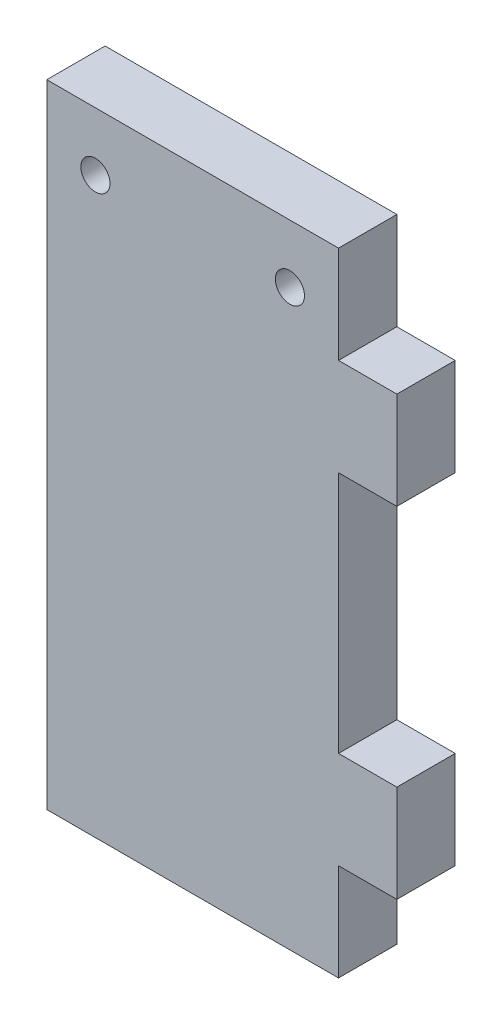
ISO-10303-21;
HEADER;
FILE_DESCRIPTION(('STEP AP214'),'2;1');
FILE_NAME('part.step','',(''),(''),'','','');
FILE_SCHEMA(('AUTOMOTIVE_DESIGN { 1 0 10303 214 1 1 1 1 }'));
ENDSEC;
DATA;
#1=APPLICATION_CONTEXT('core data for automotive mechanical design processes');
#2=APPLICATION_PROTOCOL_DEFINITION('international standard','automotive_design',2000,#1);
#3=PRODUCT_CONTEXT('',#1,'mechanical');
#4=PRODUCT('Part','Part','',(#3));
#5=PRODUCT_RELATED_PRODUCT_CATEGORY('part','',(#4));
#6=PRODUCT_DEFINITION_FORMATION('','',#4);
#7=PRODUCT_DEFINITION_CONTEXT('part definition',#1,'design');
#8=PRODUCT_DEFINITION('design','',#6,#7);
#9=PRODUCT_DEFINITION_SHAPE('','',#8);
#10=(LENGTH_UNIT() NAMED_UNIT(*) SI_UNIT(.MILLI.,.METRE.));
#11=(NAMED_UNIT(*) PLANE_ANGLE_UNIT() SI_UNIT($,.RADIAN.));
#12=(NAMED_UNIT(*) SI_UNIT($,.STERADIAN.) SOLID_ANGLE_UNIT());
#13=UNCERTAINTY_MEASURE_WITH_UNIT(LENGTH_MEASURE(1.E-05),#10,'distance_accuracy_value','');
#14=(GEOMETRIC_REPRESENTATION_CONTEXT(3) GLOBAL_UNCERTAINTY_ASSIGNED_CONTEXT((#13)) GLOBAL_UNIT_ASSIGNED_CONTEXT((#10,
#11,#12)) REPRESENTATION_CONTEXT('',''));
#15=CARTESIAN_POINT('',(0.,0.,0.));
#16=DIRECTION('',(0.,0.,1.));
#17=DIRECTION('',(1.,0.,0.));
#18=AXIS2_PLACEMENT_3D('',#15,#16,#17);
#19=CARTESIAN_POINT('',(0.,0.,6.));
#20=DIRECTION('',(-1.,0.,0.));
#21=DIRECTION('',(0.,-1.,0.));
#22=AXIS2_PLACEMENT_3D('',#19,#20,#21);
#23=PLANE('',#22);
#24=DIRECTION('',(0.,0.,-1.));
#25=VECTOR('',#24,1.);
#26=CARTESIAN_POINT('',(0.,45.,6.));
#27=LINE('',#26,#25);
#28=CARTESIAN_POINT('',(0.,45.,6.));
#29=VERTEX_POINT('',#28);
#30=CARTESIAN_POINT('',(0.,45.,0.));
#31=VERTEX_POINT('',#30);
#32=EDGE_CURVE('E56',#29,#31,#27,.T.);
#33=ORIENTED_EDGE('',*,*,#32,.F.);
#34=DIRECTION('',(0.,1.,0.));
#35=VECTOR('',#34,1.);
#36=CARTESIAN_POINT('',(0.,0.,6.));
#37=LINE('',#36,#35);
#38=CARTESIAN_POINT('',(0.,20.,6.));
#39=VERTEX_POINT('',#38);
#40=EDGE_CURVE('E147',#39,#29,#37,.T.);
#41=ORIENTED_EDGE('',*,*,#40,.F.);
#42=DIRECTION('',(0.,0.,1.));
#43=VECTOR('',#42,1.);
#44=CARTESIAN_POINT('',(0.,20.,6.));
#45=LINE('',#44,#43);
#46=CARTESIAN_POINT('',(0.,20.,0.));
#47=VERTEX_POINT('',#46);
#48=EDGE_CURVE('E151',#47,#39,#45,.T.);
#49=ORIENTED_EDGE('',*,*,#48,.F.);
#50=DIRECTION('',(0.,1.,0.));
#51=VECTOR('',#50,1.);
#52=CARTESIAN_POINT('',(0.,0.,0.));
#53=LINE('',#52,#51);
#54=EDGE_CURVE('E194',#47,#31,#53,.T.);
#55=ORIENTED_EDGE('',*,*,#54,.T.);
#56=EDGE_LOOP('',(#33,#41,#49,#55));
#57=FACE_BOUND('',#56,.T.);
#58=ADVANCED_FACE('F32',(#57),#23,.F.);
#59=DIRECTION('',(0.,0.,1.));
#60=VECTOR('',#59,1.);
#61=CARTESIAN_POINT('',(0.,55.,6.));
#62=LINE('',#61,#60);
#63=CARTESIAN_POINT('',(0.,55.,0.));
#64=VERTEX_POINT('',#63);
#65=CARTESIAN_POINT('',(0.,55.,6.));
#66=VERTEX_POINT('',#65);
#67=EDGE_CURVE('E142',#64,#66,#62,.T.);
#68=ORIENTED_EDGE('',*,*,#67,.F.);
#69=CARTESIAN_POINT('',(0.,65.,0.));
#70=VERTEX_POINT('',#69);
#71=EDGE_CURVE('E182',#64,#70,#53,.T.);
#72=ORIENTED_EDGE('',*,*,#71,.T.);
#73=DIRECTION('',(0.,0.,-1.));
#74=VECTOR('',#73,1.);
#75=CARTESIAN_POINT('',(0.,65.,6.));
#76=LINE('',#75,#74);
#77=CARTESIAN_POINT('',(0.,65.,6.));
#78=VERTEX_POINT('',#77);
#79=EDGE_CURVE('E11',#78,#70,#76,.T.);
#80=ORIENTED_EDGE('',*,*,#79,.F.);
#81=EDGE_CURVE('E35',#66,#78,#37,.T.);
#82=ORIENTED_EDGE('',*,*,#81,.F.);
#83=EDGE_LOOP('',(#68,#72,#80,#82));
#84=FACE_BOUND('',#83,.T.);
#85=ADVANCED_FACE('F247',(#84),#23,.F.);
#86=DIRECTION('',(0.,0.,-1.));
#87=VECTOR('',#86,1.);
#88=CARTESIAN_POINT('',(0.,10.,6.));
#89=LINE('',#88,#87);
#90=CARTESIAN_POINT('',(0.,10.,6.));
#91=VERTEX_POINT('',#90);
#92=CARTESIAN_POINT('',(0.,10.,0.));
#93=VERTEX_POINT('',#92);
#94=EDGE_CURVE('E148',#91,#93,#89,.T.);
#95=ORIENTED_EDGE('',*,*,#94,.F.);
#96=CARTESIAN_POINT('',(0.,0.,6.));
#97=VERTEX_POINT('',#96);
#98=EDGE_CURVE('E240',#97,#91,#37,.T.);
#99=ORIENTED_EDGE('',*,*,#98,.F.);
#100=DIRECTION('',(0.,0.,-1.));
#101=VECTOR('',#100,1.);
#102=CARTESIAN_POINT('',(0.,0.,6.));
#103=LINE('',#102,#101);
#104=CARTESIAN_POINT('',(0.,0.,0.));
#105=VERTEX_POINT('',#104);
#106=EDGE_CURVE('E213',#97,#105,#103,.T.);
#107=ORIENTED_EDGE('',*,*,#106,.T.);
#108=EDGE_CURVE('E206',#105,#93,#53,.T.);
#109=ORIENTED_EDGE('',*,*,#108,.T.);
#110=EDGE_LOOP('',(#95,#99,#107,#109));
#111=FACE_BOUND('',#110,.T.);
#112=ADVANCED_FACE('F239',(#111),#23,.F.);
#113=CARTESIAN_POINT('',(0.,65.,6.));
#114=DIRECTION('',(0.,-1.,0.));
#115=DIRECTION('',(0.,0.,-1.));
#116=AXIS2_PLACEMENT_3D('',#113,#114,#115);
#117=PLANE('',#116);
#118=DIRECTION('',(-1.,0.,0.));
#119=VECTOR('',#118,1.);
#120=CARTESIAN_POINT('',(0.,65.,0.));
#121=LINE('',#120,#119);
#122=CARTESIAN_POINT('',(-30.,65.,0.));
#123=VERTEX_POINT('',#122);
#124=EDGE_CURVE('E200',#70,#123,#121,.T.);
#125=ORIENTED_EDGE('',*,*,#124,.T.);
#126=DIRECTION('',(0.,0.,-1.));
#127=VECTOR('',#126,1.);
#128=CARTESIAN_POINT('',(-30.,65.,6.));
#129=LINE('',#128,#127);
#130=CARTESIAN_POINT('',(-30.,65.,6.));
#131=VERTEX_POINT('',#130);
#132=EDGE_CURVE('E41',#131,#123,#129,.T.);
#133=ORIENTED_EDGE('',*,*,#132,.F.);
#134=DIRECTION('',(-1.,0.,0.));
#135=VECTOR('',#134,1.);
#136=CARTESIAN_POINT('',(0.,65.,6.));
#137=LINE('',#136,#135);
#138=EDGE_CURVE('E242',#78,#131,#137,.T.);
#139=ORIENTED_EDGE('',*,*,#138,.F.);
#140=ORIENTED_EDGE('',*,*,#79,.T.);
#141=EDGE_LOOP('',(#125,#133,#139,#140));
#142=FACE_BOUND('',#141,.T.);
#143=ADVANCED_FACE('F224',(#142),#117,.F.);
#144=CARTESIAN_POINT('',(-30.,0.,6.));
#145=DIRECTION('',(1.,0.,0.));
#146=DIRECTION('',(0.,0.,-1.));
#147=AXIS2_PLACEMENT_3D('',#144,#145,#146);
#148=PLANE('',#147);
#149=DIRECTION('',(0.,-1.,0.));
#150=VECTOR('',#149,1.);
#151=CARTESIAN_POINT('',(-30.,0.,0.));
#152=LINE('',#151,#150);
#153=CARTESIAN_POINT('',(-30.,0.,0.));
#154=VERTEX_POINT('',#153);
#155=EDGE_CURVE('E217',#123,#154,#152,.T.);
#156=ORIENTED_EDGE('',*,*,#155,.T.);
#157=DIRECTION('',(0.,0.,-1.));
#158=VECTOR('',#157,1.);
#159=CARTESIAN_POINT('',(-30.,0.,6.));
#160=LINE('',#159,#158);
#161=CARTESIAN_POINT('',(-30.,0.,6.));
#162=VERTEX_POINT('',#161);
#163=EDGE_CURVE('E210',#162,#154,#160,.T.);
#164=ORIENTED_EDGE('',*,*,#163,.F.);
#165=DIRECTION('',(0.,-1.,0.));
#166=VECTOR('',#165,1.);
#167=CARTESIAN_POINT('',(-30.,0.,6.));
#168=LINE('',#167,#166);
#169=EDGE_CURVE('E229',#131,#162,#168,.T.);
#170=ORIENTED_EDGE('',*,*,#169,.F.);
#171=ORIENTED_EDGE('',*,*,#132,.T.);
#172=EDGE_LOOP('',(#156,#164,#170,#171));
#173=FACE_BOUND('',#172,.T.);
#174=ADVANCED_FACE('F228',(#173),#148,.F.);
#175=CARTESIAN_POINT('',(0.,0.,6.));
#176=DIRECTION('',(0.,1.,0.));
#177=DIRECTION('',(-1.,0.,0.));
#178=AXIS2_PLACEMENT_3D('',#175,#176,#177);
#179=PLANE('',#178);
#180=DIRECTION('',(1.,0.,0.));
#181=VECTOR('',#180,1.);
#182=CARTESIAN_POINT('',(0.,0.,0.));
#183=LINE('',#182,#181);
#184=EDGE_CURVE('E216',#154,#105,#183,.T.);
#185=ORIENTED_EDGE('',*,*,#184,.T.);
#186=ORIENTED_EDGE('',*,*,#106,.F.);
#187=DIRECTION('',(1.,0.,0.));
#188=VECTOR('',#187,1.);
#189=CARTESIAN_POINT('',(0.,0.,6.));
#190=LINE('',#189,#188);
#191=EDGE_CURVE('E198',#162,#97,#190,.T.);
#192=ORIENTED_EDGE('',*,*,#191,.F.);
#193=ORIENTED_EDGE('',*,*,#163,.T.);
#194=EDGE_LOOP('',(#185,#186,#192,#193));
#195=FACE_BOUND('',#194,.T.);
#196=ADVANCED_FACE('F235',(#195),#179,.F.);
#197=CARTESIAN_POINT('',(0.,0.,6.));
#198=DIRECTION('',(0.,0.,1.));
#199=DIRECTION('',(1.,0.,0.));
#200=AXIS2_PLACEMENT_3D('',#197,#198,#199);
#201=PLANE('',#200);
#202=CARTESIAN_POINT('',(-5.,59.,6.));
#203=DIRECTION('',(0.,0.,1.));
#204=DIRECTION('',(1.,0.,0.));
#205=AXIS2_PLACEMENT_3D('',#202,#203,#204);
#206=CIRCLE('',#205,1.5);
#207=CARTESIAN_POINT('',(-3.5,59.,6.));
#208=VERTEX_POINT('',#207);
#209=EDGE_CURVE('E268',#208,#208,#206,.T.);
#210=ORIENTED_EDGE('',*,*,#209,.F.);
#211=EDGE_LOOP('',(#210));
#212=FACE_BOUND('',#211,.T.);
#213=CARTESIAN_POINT('',(-25.,59.,6.));
#214=DIRECTION('',(0.,0.,1.));
#215=DIRECTION('',(1.,0.,0.));
#216=AXIS2_PLACEMENT_3D('',#213,#214,#215);
#217=CIRCLE('',#216,1.5);
#218=CARTESIAN_POINT('',(-23.5,59.,6.));
#219=VERTEX_POINT('',#218);
#220=EDGE_CURVE('E260',#219,#219,#217,.T.);
#221=ORIENTED_EDGE('',*,*,#220,.F.);
#222=EDGE_LOOP('',(#221));
#223=FACE_BOUND('',#222,.T.);
#224=ORIENTED_EDGE('',*,*,#98,.T.);
#225=DIRECTION('',(-1.,0.,0.));
#226=VECTOR('',#225,1.);
#227=CARTESIAN_POINT('',(6.,10.,6.));
#228=LINE('',#227,#226);
#229=CARTESIAN_POINT('',(6.,10.,6.));
#230=VERTEX_POINT('',#229);
#231=EDGE_CURVE('E176',#230,#91,#228,.T.);
#232=ORIENTED_EDGE('',*,*,#231,.F.);
#233=DIRECTION('',(0.,-1.,0.));
#234=VECTOR('',#233,1.);
#235=CARTESIAN_POINT('',(6.,20.,6.));
#236=LINE('',#235,#234);
#237=CARTESIAN_POINT('',(6.,20.,6.));
#238=VERTEX_POINT('',#237);
#239=EDGE_CURVE('E157',#238,#230,#236,.T.);
#240=ORIENTED_EDGE('',*,*,#239,.F.);
#241=DIRECTION('',(-1.,0.,0.));
#242=VECTOR('',#241,1.);
#243=CARTESIAN_POINT('',(6.,20.,6.));
#244=LINE('',#243,#242);
#245=EDGE_CURVE('E166',#238,#39,#244,.T.);
#246=ORIENTED_EDGE('',*,*,#245,.T.);
#247=ORIENTED_EDGE('',*,*,#40,.T.);
#248=DIRECTION('',(-1.,0.,0.));
#249=VECTOR('',#248,1.);
#250=CARTESIAN_POINT('',(6.,45.,6.));
#251=LINE('',#250,#249);
#252=CARTESIAN_POINT('',(6.,45.,6.));
#253=VERTEX_POINT('',#252);
#254=EDGE_CURVE('E127',#253,#29,#251,.T.);
#255=ORIENTED_EDGE('',*,*,#254,.F.);
#256=DIRECTION('',(0.,-1.,0.));
#257=VECTOR('',#256,1.);
#258=CARTESIAN_POINT('',(6.,55.,6.));
#259=LINE('',#258,#257);
#260=CARTESIAN_POINT('',(6.,55.,6.));
#261=VERTEX_POINT('',#260);
#262=EDGE_CURVE('E133',#261,#253,#259,.T.);
#263=ORIENTED_EDGE('',*,*,#262,.F.);
#264=DIRECTION('',(-1.,0.,0.));
#265=VECTOR('',#264,1.);
#266=CARTESIAN_POINT('',(6.,55.,6.));
#267=LINE('',#266,#265);
#268=EDGE_CURVE('E251',#261,#66,#267,.T.);
#269=ORIENTED_EDGE('',*,*,#268,.T.);
#270=ORIENTED_EDGE('',*,*,#81,.T.);
#271=ORIENTED_EDGE('',*,*,#138,.T.);
#272=ORIENTED_EDGE('',*,*,#169,.T.);
#273=ORIENTED_EDGE('',*,*,#191,.T.);
#274=EDGE_LOOP('',(#224,#232,#240,#246,#247,#255,#263,#269,#270,#271,#272,#273));
#275=FACE_BOUND('',#274,.T.);
#276=ADVANCED_FACE('F145',(#212,#223,#275),#201,.T.);
#277=CARTESIAN_POINT('',(0.,0.,0.));
#278=DIRECTION('',(0.,0.,1.));
#279=DIRECTION('',(1.,0.,0.));
#280=AXIS2_PLACEMENT_3D('',#277,#278,#279);
#281=PLANE('',#280);
#282=CARTESIAN_POINT('',(-5.,59.,0.));
#283=DIRECTION('',(0.,0.,1.));
#284=DIRECTION('',(1.,0.,0.));
#285=AXIS2_PLACEMENT_3D('',#282,#283,#284);
#286=CIRCLE('',#285,1.5);
#287=CARTESIAN_POINT('',(-3.5,59.,0.));
#288=VERTEX_POINT('',#287);
#289=EDGE_CURVE('E265',#288,#288,#286,.T.);
#290=ORIENTED_EDGE('',*,*,#289,.T.);
#291=EDGE_LOOP('',(#290));
#292=FACE_BOUND('',#291,.T.);
#293=CARTESIAN_POINT('',(-25.,59.,0.));
#294=DIRECTION('',(0.,0.,1.));
#295=DIRECTION('',(1.,0.,0.));
#296=AXIS2_PLACEMENT_3D('',#293,#294,#295);
#297=CIRCLE('',#296,1.5);
#298=CARTESIAN_POINT('',(-23.5,59.,0.));
#299=VERTEX_POINT('',#298);
#300=EDGE_CURVE('E258',#299,#299,#297,.T.);
#301=ORIENTED_EDGE('',*,*,#300,.T.);
#302=EDGE_LOOP('',(#301));
#303=FACE_BOUND('',#302,.T.);
#304=ORIENTED_EDGE('',*,*,#108,.F.);
#305=ORIENTED_EDGE('',*,*,#184,.F.);
#306=ORIENTED_EDGE('',*,*,#155,.F.);
#307=ORIENTED_EDGE('',*,*,#124,.F.);
#308=ORIENTED_EDGE('',*,*,#71,.F.);
#309=DIRECTION('',(-1.,0.,0.));
#310=VECTOR('',#309,1.);
#311=CARTESIAN_POINT('',(6.,55.,0.));
#312=LINE('',#311,#310);
#313=CARTESIAN_POINT('',(6.,55.,0.));
#314=VERTEX_POINT('',#313);
#315=EDGE_CURVE('E153',#314,#64,#312,.T.);
#316=ORIENTED_EDGE('',*,*,#315,.F.);
#317=DIRECTION('',(0.,1.,0.));
#318=VECTOR('',#317,1.);
#319=CARTESIAN_POINT('',(6.,55.,0.));
#320=LINE('',#319,#318);
#321=CARTESIAN_POINT('',(6.,45.,0.));
#322=VERTEX_POINT('',#321);
#323=EDGE_CURVE('E132',#322,#314,#320,.T.);
#324=ORIENTED_EDGE('',*,*,#323,.F.);
#325=DIRECTION('',(-1.,0.,0.));
#326=VECTOR('',#325,1.);
#327=CARTESIAN_POINT('',(6.,45.,0.));
#328=LINE('',#327,#326);
#329=EDGE_CURVE('E129',#322,#31,#328,.T.);
#330=ORIENTED_EDGE('',*,*,#329,.T.);
#331=ORIENTED_EDGE('',*,*,#54,.F.);
#332=DIRECTION('',(-1.,0.,0.));
#333=VECTOR('',#332,1.);
#334=CARTESIAN_POINT('',(6.,20.,0.));
#335=LINE('',#334,#333);
#336=CARTESIAN_POINT('',(6.,20.,0.));
#337=VERTEX_POINT('',#336);
#338=EDGE_CURVE('E177',#337,#47,#335,.T.);
#339=ORIENTED_EDGE('',*,*,#338,.F.);
#340=DIRECTION('',(0.,1.,0.));
#341=VECTOR('',#340,1.);
#342=CARTESIAN_POINT('',(6.,20.,0.));
#343=LINE('',#342,#341);
#344=CARTESIAN_POINT('',(6.,10.,0.));
#345=VERTEX_POINT('',#344);
#346=EDGE_CURVE('E162',#345,#337,#343,.T.);
#347=ORIENTED_EDGE('',*,*,#346,.F.);
#348=DIRECTION('',(-1.,0.,0.));
#349=VECTOR('',#348,1.);
#350=CARTESIAN_POINT('',(6.,10.,0.));
#351=LINE('',#350,#349);
#352=EDGE_CURVE('E173',#345,#93,#351,.T.);
#353=ORIENTED_EDGE('',*,*,#352,.T.);
#354=EDGE_LOOP('',(#304,#305,#306,#307,#308,#316,#324,#330,#331,#339,#347,#353));
#355=FACE_BOUND('',#354,.T.);
#356=ADVANCED_FACE('F232',(#292,#303,#355),#281,.F.);
#357=CARTESIAN_POINT('',(6.,10.,6.));
#358=DIRECTION('',(0.,1.,0.));
#359=DIRECTION('',(-1.,0.,0.));
#360=AXIS2_PLACEMENT_3D('',#357,#358,#359);
#361=PLANE('',#360);
#362=ORIENTED_EDGE('',*,*,#94,.T.);
#363=ORIENTED_EDGE('',*,*,#352,.F.);
#364=DIRECTION('',(0.,0.,-1.));
#365=VECTOR('',#364,1.);
#366=CARTESIAN_POINT('',(6.,10.,6.));
#367=LINE('',#366,#365);
#368=EDGE_CURVE('E160',#230,#345,#367,.T.);
#369=ORIENTED_EDGE('',*,*,#368,.F.);
#370=ORIENTED_EDGE('',*,*,#231,.T.);
#371=EDGE_LOOP('',(#362,#363,#369,#370));
#372=FACE_BOUND('',#371,.T.);
#373=ADVANCED_FACE('F310',(#372),#361,.F.);
#374=CARTESIAN_POINT('',(6.,20.,6.));
#375=DIRECTION('',(0.,-1.,0.));
#376=DIRECTION('',(1.,0.,0.));
#377=AXIS2_PLACEMENT_3D('',#374,#375,#376);
#378=PLANE('',#377);
#379=ORIENTED_EDGE('',*,*,#48,.T.);
#380=ORIENTED_EDGE('',*,*,#245,.F.);
#381=DIRECTION('',(0.,0.,1.));
#382=VECTOR('',#381,1.);
#383=CARTESIAN_POINT('',(6.,20.,6.));
#384=LINE('',#383,#382);
#385=EDGE_CURVE('E164',#337,#238,#384,.T.);
#386=ORIENTED_EDGE('',*,*,#385,.F.);
#387=ORIENTED_EDGE('',*,*,#338,.T.);
#388=EDGE_LOOP('',(#379,#380,#386,#387));
#389=FACE_BOUND('',#388,.T.);
#390=ADVANCED_FACE('F314',(#389),#378,.F.);
#391=CARTESIAN_POINT('',(6.,0.,0.));
#392=DIRECTION('',(1.,0.,0.));
#393=DIRECTION('',(0.,1.,0.));
#394=AXIS2_PLACEMENT_3D('',#391,#392,#393);
#395=PLANE('',#394);
#396=ORIENTED_EDGE('',*,*,#239,.T.);
#397=ORIENTED_EDGE('',*,*,#368,.T.);
#398=ORIENTED_EDGE('',*,*,#346,.T.);
#399=ORIENTED_EDGE('',*,*,#385,.T.);
#400=EDGE_LOOP('',(#396,#397,#398,#399));
#401=FACE_BOUND('',#400,.T.);
#402=ADVANCED_FACE('F318',(#401),#395,.T.);
#403=CARTESIAN_POINT('',(6.,45.,6.));
#404=DIRECTION('',(0.,1.,0.));
#405=DIRECTION('',(-1.,0.,0.));
#406=AXIS2_PLACEMENT_3D('',#403,#404,#405);
#407=PLANE('',#406);
#408=ORIENTED_EDGE('',*,*,#32,.T.);
#409=ORIENTED_EDGE('',*,*,#329,.F.);
#410=DIRECTION('',(0.,0.,-1.));
#411=VECTOR('',#410,1.);
#412=CARTESIAN_POINT('',(6.,45.,6.));
#413=LINE('',#412,#411);
#414=EDGE_CURVE('E123',#253,#322,#413,.T.);
#415=ORIENTED_EDGE('',*,*,#414,.F.);
#416=ORIENTED_EDGE('',*,*,#254,.T.);
#417=EDGE_LOOP('',(#408,#409,#415,#416));
#418=FACE_BOUND('',#417,.T.);
#419=ADVANCED_FACE('F125',(#418),#407,.F.);
#420=CARTESIAN_POINT('',(6.,55.,6.));
#421=DIRECTION('',(0.,-1.,0.));
#422=DIRECTION('',(1.,0.,0.));
#423=AXIS2_PLACEMENT_3D('',#420,#421,#422);
#424=PLANE('',#423);
#425=ORIENTED_EDGE('',*,*,#67,.T.);
#426=ORIENTED_EDGE('',*,*,#268,.F.);
#427=DIRECTION('',(0.,0.,1.));
#428=VECTOR('',#427,1.);
#429=CARTESIAN_POINT('',(6.,55.,6.));
#430=LINE('',#429,#428);
#431=EDGE_CURVE('E138',#314,#261,#430,.T.);
#432=ORIENTED_EDGE('',*,*,#431,.F.);
#433=ORIENTED_EDGE('',*,*,#315,.T.);
#434=EDGE_LOOP('',(#425,#426,#432,#433));
#435=FACE_BOUND('',#434,.T.);
#436=ADVANCED_FACE('F252',(#435),#424,.F.);
#437=CARTESIAN_POINT('',(6.,0.,0.));
#438=DIRECTION('',(1.,0.,0.));
#439=DIRECTION('',(0.,1.,0.));
#440=AXIS2_PLACEMENT_3D('',#437,#438,#439);
#441=PLANE('',#440);
#442=ORIENTED_EDGE('',*,*,#262,.T.);
#443=ORIENTED_EDGE('',*,*,#414,.T.);
#444=ORIENTED_EDGE('',*,*,#323,.T.);
#445=ORIENTED_EDGE('',*,*,#431,.T.);
#446=EDGE_LOOP('',(#442,#443,#444,#445));
#447=FACE_BOUND('',#446,.T.);
#448=ADVANCED_FACE('F136',(#447),#441,.T.);
#449=CARTESIAN_POINT('',(-25.,59.,0.));
#450=DIRECTION('',(0.,0.,1.));
#451=DIRECTION('',(1.,0.,0.));
#452=AXIS2_PLACEMENT_3D('',#449,#450,#451);
#453=CYLINDRICAL_SURFACE('',#452,1.5);
#454=ORIENTED_EDGE('',*,*,#300,.F.);
#455=EDGE_LOOP('',(#454));
#456=FACE_BOUND('',#455,.T.);
#457=ORIENTED_EDGE('',*,*,#220,.T.);
#458=EDGE_LOOP('',(#457));
#459=FACE_BOUND('',#458,.T.);
#460=ADVANCED_FACE('F278',(#456,#459),#453,.F.);
#461=CARTESIAN_POINT('',(-5.,59.,0.));
#462=DIRECTION('',(0.,0.,1.));
#463=DIRECTION('',(1.,0.,0.));
#464=AXIS2_PLACEMENT_3D('',#461,#462,#463);
#465=CYLINDRICAL_SURFACE('',#464,1.5);
#466=ORIENTED_EDGE('',*,*,#289,.F.);
#467=EDGE_LOOP('',(#466));
#468=FACE_BOUND('',#467,.T.);
#469=ORIENTED_EDGE('',*,*,#209,.T.);
#470=EDGE_LOOP('',(#469));
#471=FACE_BOUND('',#470,.T.);
#472=ADVANCED_FACE('F275',(#468,#471),#465,.F.);
#473=CLOSED_SHELL('',(#58,#85,#112,#143,#174,#196,#276,#356,#373,#390,#402,#419,#436,#448,#460,#472));
#474=MANIFOLD_SOLID_BREP('B2',#473);
#475=ADVANCED_BREP_SHAPE_REPRESENTATION('',(#18,#474),#14);
#476=SHAPE_DEFINITION_REPRESENTATION(#9,#475);
ENDSEC;
END-ISO-10303-21;
